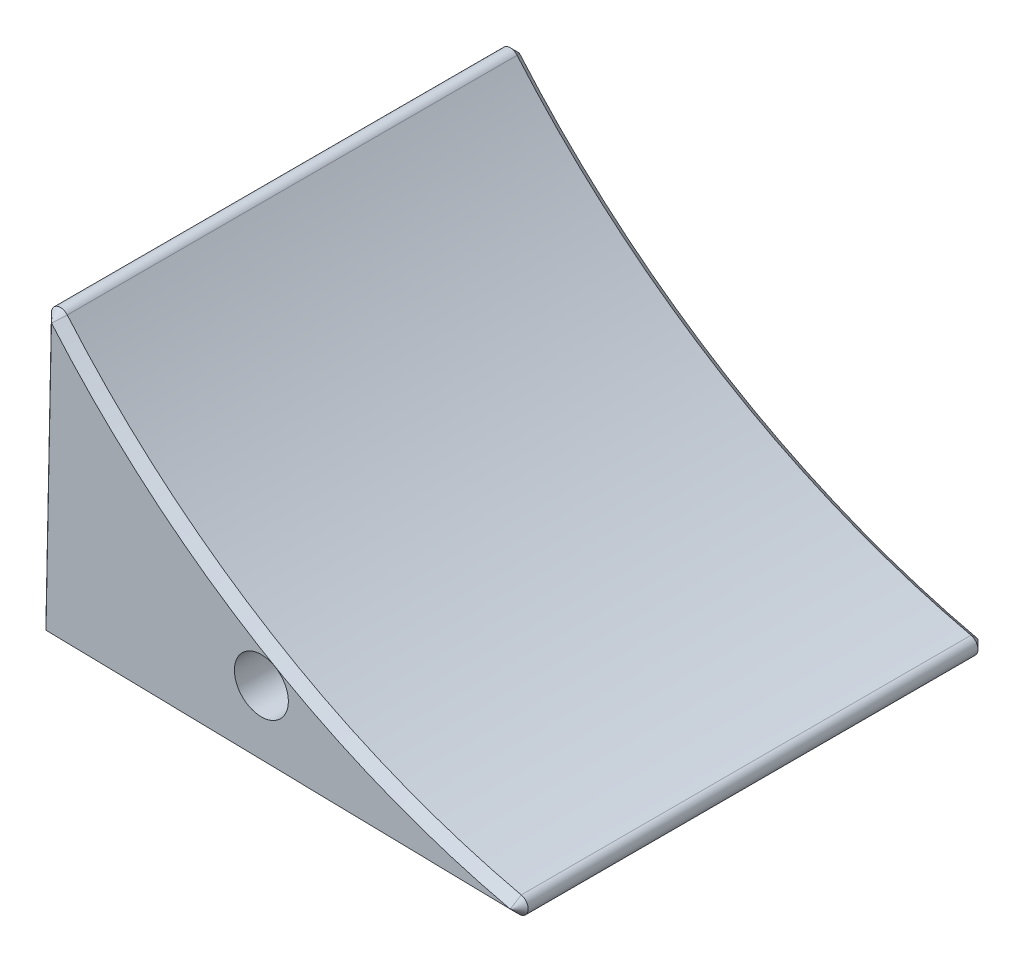
ISO-10303-21;
HEADER;
FILE_DESCRIPTION(('STEP AP214'),'2;1');
FILE_NAME('part.step','',(''),(''),'','','');
FILE_SCHEMA(('AUTOMOTIVE_DESIGN { 1 0 10303 214 1 1 1 1 }'));
ENDSEC;
DATA;
#1=APPLICATION_CONTEXT('core data for automotive mechanical design processes');
#2=APPLICATION_PROTOCOL_DEFINITION('international standard','automotive_design',2000,#1);
#3=PRODUCT_CONTEXT('',#1,'mechanical');
#4=PRODUCT('Part','Part','',(#3));
#5=PRODUCT_RELATED_PRODUCT_CATEGORY('part','',(#4));
#6=PRODUCT_DEFINITION_FORMATION('','',#4);
#7=PRODUCT_DEFINITION_CONTEXT('part definition',#1,'design');
#8=PRODUCT_DEFINITION('design','',#6,#7);
#9=PRODUCT_DEFINITION_SHAPE('','',#8);
#10=(LENGTH_UNIT() NAMED_UNIT(*) SI_UNIT(.MILLI.,.METRE.));
#11=(NAMED_UNIT(*) PLANE_ANGLE_UNIT() SI_UNIT($,.RADIAN.));
#12=(NAMED_UNIT(*) SI_UNIT($,.STERADIAN.) SOLID_ANGLE_UNIT());
#13=UNCERTAINTY_MEASURE_WITH_UNIT(LENGTH_MEASURE(1.E-05),#10,'distance_accuracy_value','');
#14=(GEOMETRIC_REPRESENTATION_CONTEXT(3) GLOBAL_UNCERTAINTY_ASSIGNED_CONTEXT((#13)) GLOBAL_UNIT_ASSIGNED_CONTEXT((#10,
#11,#12)) REPRESENTATION_CONTEXT('',''));
#15=CARTESIAN_POINT('',(0.,0.,0.));
#16=DIRECTION('',(0.,0.,1.));
#17=DIRECTION('',(1.,0.,0.));
#18=AXIS2_PLACEMENT_3D('',#15,#16,#17);
#19=CARTESIAN_POINT('',(-175.575532096117,156.509788423586,66.0260508410759));
#20=DIRECTION('',(0.,0.,-1.));
#21=DIRECTION('',(-1.,0.,0.));
#22=AXIS2_PLACEMENT_3D('',#19,#20,#21);
#23=CYLINDRICAL_SURFACE('',#22,47.);
#24=DIRECTION('',(0.,0.,-1.));
#25=VECTOR('',#24,1.);
#26=CARTESIAN_POINT('',(-211.327703681968,126.001064640119,66.0260508410759));
#27=LINE('',#26,#25);
#28=CARTESIAN_POINT('',(-211.327703681968,126.001064640119,0.5));
#29=VERTEX_POINT('',#28);
#30=CARTESIAN_POINT('',(-211.327703681968,126.001064640119,25.5));
#31=VERTEX_POINT('',#30);
#32=EDGE_CURVE('E115',#29,#31,#27,.F.);
#33=ORIENTED_EDGE('',*,*,#32,.T.);
#34=CARTESIAN_POINT('',(-175.575532096117,156.509788423586,25.5));
#35=DIRECTION('',(0.,0.,1.));
#36=DIRECTION('',(1.,0.,0.));
#37=AXIS2_PLACEMENT_3D('',#34,#35,#36);
#38=CIRCLE('',#37,47.);
#39=CARTESIAN_POINT('',(-186.099642102596,110.703204742073,25.5));
#40=VERTEX_POINT('',#39);
#41=EDGE_CURVE('E121',#31,#40,#38,.T.);
#42=ORIENTED_EDGE('',*,*,#41,.T.);
#43=DIRECTION('',(0.,0.,-1.));
#44=VECTOR('',#43,1.);
#45=CARTESIAN_POINT('',(-186.099642102596,110.703204742073,66.0260508410759));
#46=LINE('',#45,#44);
#47=CARTESIAN_POINT('',(-186.099642102596,110.703204742073,0.5));
#48=VERTEX_POINT('',#47);
#49=EDGE_CURVE('E117',#40,#48,#46,.T.);
#50=ORIENTED_EDGE('',*,*,#49,.T.);
#51=CARTESIAN_POINT('',(-175.575532096117,156.509788423586,0.5));
#52=DIRECTION('',(0.,0.,1.));
#53=DIRECTION('',(1.,0.,0.));
#54=AXIS2_PLACEMENT_3D('',#51,#52,#53);
#55=CIRCLE('',#54,47.);
#56=EDGE_CURVE('E113',#48,#29,#55,.F.);
#57=ORIENTED_EDGE('',*,*,#56,.T.);
#58=EDGE_LOOP('',(#33,#42,#50,#57));
#59=FACE_BOUND('',#58,.T.);
#60=ADVANCED_FACE('F37',(#59),#23,.F.);
#61=CARTESIAN_POINT('',(-212.180704616447,127.029942006808,66.0260508410759));
#62=DIRECTION('',(0.999794478558421,-0.0202731508181385,0.));
#63=DIRECTION('',(0.0202731508181385,0.999794478558421,0.));
#64=AXIS2_PLACEMENT_3D('',#61,#62,#63);
#65=PLANE('',#64);
#66=DIRECTION('',(0.,0.,-1.));
#67=VECTOR('',#66,1.);
#68=CARTESIAN_POINT('',(-212.510834837265,110.749178600073,66.0260508410759));
#69=LINE('',#68,#67);
#70=CARTESIAN_POINT('',(-212.510834837265,110.749178600073,0.5));
#71=VERTEX_POINT('',#70);
#72=CARTESIAN_POINT('',(-212.510834837265,110.749178600073,25.5));
#73=VERTEX_POINT('',#72);
#74=EDGE_CURVE('E201',#71,#73,#69,.F.);
#75=ORIENTED_EDGE('',*,*,#74,.T.);
#76=DIRECTION('',(0.0202731508181385,0.999794478558421,0.));
#77=VECTOR('',#76,1.);
#78=CARTESIAN_POINT('',(-212.20794317216,125.686640324215,25.5));
#79=LINE('',#78,#77);
#80=CARTESIAN_POINT('',(-212.20794317216,125.686640324215,25.5));
#81=VERTEX_POINT('',#80);
#82=EDGE_CURVE('E122',#73,#81,#79,.T.);
#83=ORIENTED_EDGE('',*,*,#82,.T.);
#84=DIRECTION('',(0.,0.,-1.));
#85=VECTOR('',#84,1.);
#86=CARTESIAN_POINT('',(-212.20794317216,125.686640324215,66.0260508410759));
#87=LINE('',#86,#85);
#88=CARTESIAN_POINT('',(-212.20794317216,125.686640324215,0.5));
#89=VERTEX_POINT('',#88);
#90=EDGE_CURVE('E138',#81,#89,#87,.T.);
#91=ORIENTED_EDGE('',*,*,#90,.T.);
#92=DIRECTION('',(-0.0202731508181385,-0.999794478558421,0.));
#93=VECTOR('',#92,1.);
#94=CARTESIAN_POINT('',(-212.180704616447,127.029942006808,0.5));
#95=LINE('',#94,#93);
#96=EDGE_CURVE('E213',#89,#71,#95,.T.);
#97=ORIENTED_EDGE('',*,*,#96,.T.);
#98=EDGE_LOOP('',(#75,#83,#91,#97));
#99=FACE_BOUND('',#98,.T.);
#100=ADVANCED_FACE('F239',(#99),#65,.F.);
#101=CARTESIAN_POINT('',(-212.520971412675,110.249281360793,66.0260508410759));
#102=DIRECTION('',(0.0202731508181363,0.999794478558421,0.));
#103=DIRECTION('',(-0.999794478558421,0.0202731508181363,0.));
#104=AXIS2_PLACEMENT_3D('',#101,#102,#103);
#105=PLANE('',#104);
#106=DIRECTION('',(0.,0.,-1.));
#107=VECTOR('',#106,1.);
#108=CARTESIAN_POINT('',(-186.221737295096,109.716003421075,66.0260508410759));
#109=LINE('',#108,#107);
#110=CARTESIAN_POINT('',(-186.221737295096,109.716003421075,0.5));
#111=VERTEX_POINT('',#110);
#112=CARTESIAN_POINT('',(-186.221737295096,109.716003421075,25.5));
#113=VERTEX_POINT('',#112);
#114=EDGE_CURVE('E198',#111,#113,#109,.F.);
#115=ORIENTED_EDGE('',*,*,#114,.T.);
#116=DIRECTION('',(-0.999794478558421,0.0202731508181363,0.));
#117=VECTOR('',#116,1.);
#118=CARTESIAN_POINT('',(-212.021074173395,110.239144785384,25.5));
#119=LINE('',#118,#117);
#120=CARTESIAN_POINT('',(-212.021074173395,110.239144785384,25.5));
#121=VERTEX_POINT('',#120);
#122=EDGE_CURVE('E227',#113,#121,#119,.T.);
#123=ORIENTED_EDGE('',*,*,#122,.T.);
#124=DIRECTION('',(0.,0.,-1.));
#125=VECTOR('',#124,1.);
#126=CARTESIAN_POINT('',(-212.021074173395,110.239144785384,66.0260508410759));
#127=LINE('',#126,#125);
#128=CARTESIAN_POINT('',(-212.021074173395,110.239144785384,0.5));
#129=VERTEX_POINT('',#128);
#130=EDGE_CURVE('E195',#121,#129,#127,.T.);
#131=ORIENTED_EDGE('',*,*,#130,.T.);
#132=DIRECTION('',(0.999794478558421,-0.0202731508181363,0.));
#133=VECTOR('',#132,1.);
#134=CARTESIAN_POINT('',(-212.520971412675,110.249281360793,0.5));
#135=LINE('',#134,#133);
#136=EDGE_CURVE('E225',#129,#111,#135,.T.);
#137=ORIENTED_EDGE('',*,*,#136,.T.);
#138=EDGE_LOOP('',(#115,#123,#131,#137));
#139=FACE_BOUND('',#138,.T.);
#140=ADVANCED_FACE('F264',(#139),#105,.F.);
#141=CARTESIAN_POINT('',(-175.575532096117,156.509788423586,0.));
#142=DIRECTION('',(0.,0.,1.));
#143=DIRECTION('',(1.,0.,0.));
#144=AXIS2_PLACEMENT_3D('',#141,#142,#143);
#145=PLANE('',#144);
#146=DIRECTION('',(-0.999794478558421,0.0202731508181363,0.));
#147=VECTOR('',#146,1.);
#148=CARTESIAN_POINT('',(-176.51823360916,110.01934517062,0.));
#149=LINE('',#148,#147);
#150=CARTESIAN_POINT('',(-186.211600719686,110.215900660355,0.));
#151=VERTEX_POINT('',#150);
#152=CARTESIAN_POINT('',(-212.010937597986,110.739042024664,0.));
#153=VERTEX_POINT('',#152);
#154=EDGE_CURVE('E62',#151,#153,#149,.T.);
#155=ORIENTED_EDGE('',*,*,#154,.T.);
#156=DIRECTION('',(0.0202731508181385,0.999794478558421,0.));
#157=VECTOR('',#156,1.);
#158=CARTESIAN_POINT('',(-211.068236084943,157.22948527763,0.));
#159=LINE('',#158,#157);
#160=CARTESIAN_POINT('',(-211.708045932881,125.676503748806,0.));
#161=VERTEX_POINT('',#160);
#162=EDGE_CURVE('E11',#153,#161,#159,.T.);
#163=ORIENTED_EDGE('',*,*,#162,.T.);
#164=CARTESIAN_POINT('',(-175.575532096117,156.509788423586,0.));
#165=DIRECTION('',(0.,0.,1.));
#166=DIRECTION('',(1.,0.,0.));
#167=AXIS2_PLACEMENT_3D('',#164,#165,#166);
#168=CIRCLE('',#167,47.5);
#169=EDGE_CURVE('E47',#161,#151,#168,.T.);
#170=ORIENTED_EDGE('',*,*,#169,.T.);
#171=EDGE_LOOP('',(#155,#163,#170));
#172=FACE_BOUND('',#171,.T.);
#173=CARTESIAN_POINT('',(-200.041202678783,114.052661860479,0.));
#174=DIRECTION('',(0.,0.,1.));
#175=DIRECTION('',(1.,0.,0.));
#176=AXIS2_PLACEMENT_3D('',#173,#174,#175);
#177=CIRCLE('',#176,1.49999999999857);
#178=CARTESIAN_POINT('',(-198.541202678784,114.052661860479,0.));
#179=VERTEX_POINT('',#178);
#180=EDGE_CURVE('E133',#179,#179,#177,.T.);
#181=ORIENTED_EDGE('',*,*,#180,.T.);
#182=EDGE_LOOP('',(#181));
#183=FACE_BOUND('',#182,.T.);
#184=ADVANCED_FACE('F229',(#172,#183),#145,.F.);
#185=CARTESIAN_POINT('',(-175.575532096131,156.509788423579,26.));
#186=DIRECTION('',(0.,0.,1.));
#187=DIRECTION('',(-0.721296738001005,-0.692626173162053,0.));
#188=AXIS2_PLACEMENT_3D('',#185,#186,#187);
#189=PLANE('',#188);
#190=CARTESIAN_POINT('',(-175.575532096117,156.509788423586,26.));
#191=DIRECTION('',(0.,0.,1.));
#192=DIRECTION('',(1.,0.,0.));
#193=AXIS2_PLACEMENT_3D('',#190,#191,#192);
#194=CIRCLE('',#193,47.5);
#195=CARTESIAN_POINT('',(-186.211600719686,110.215900660355,26.));
#196=VERTEX_POINT('',#195);
#197=CARTESIAN_POINT('',(-211.708045932881,125.676503748806,26.));
#198=VERTEX_POINT('',#197);
#199=EDGE_CURVE('E208',#196,#198,#194,.F.);
#200=ORIENTED_EDGE('',*,*,#199,.T.);
#201=DIRECTION('',(-0.0202731508181385,-0.999794478558421,0.));
#202=VECTOR('',#201,1.);
#203=CARTESIAN_POINT('',(-212.010937597986,110.739042024664,26.0000000000001));
#204=LINE('',#203,#202);
#205=CARTESIAN_POINT('',(-212.010937597986,110.739042024664,26.0000000000001));
#206=VERTEX_POINT('',#205);
#207=EDGE_CURVE('E210',#198,#206,#204,.T.);
#208=ORIENTED_EDGE('',*,*,#207,.T.);
#209=DIRECTION('',(0.999794478558421,-0.0202731508181363,0.));
#210=VECTOR('',#209,1.);
#211=CARTESIAN_POINT('',(-186.211600719687,110.215900660355,26.));
#212=LINE('',#211,#210);
#213=EDGE_CURVE('E206',#206,#196,#212,.T.);
#214=ORIENTED_EDGE('',*,*,#213,.T.);
#215=EDGE_LOOP('',(#200,#208,#214));
#216=FACE_BOUND('',#215,.T.);
#217=CARTESIAN_POINT('',(-200.041202678783,114.052661860479,26.0000000000001));
#218=DIRECTION('',(0.,0.,-1.));
#219=DIRECTION('',(-1.,0.,0.));
#220=AXIS2_PLACEMENT_3D('',#217,#218,#219);
#221=CIRCLE('',#220,1.49999999999857);
#222=CARTESIAN_POINT('',(-201.541202678782,114.052661860479,26.0000000000001));
#223=VERTEX_POINT('',#222);
#224=EDGE_CURVE('E182',#223,#223,#221,.T.);
#225=ORIENTED_EDGE('',*,*,#224,.T.);
#226=EDGE_LOOP('',(#225));
#227=FACE_BOUND('',#226,.T.);
#228=ADVANCED_FACE('F259',(#216,#227),#189,.T.);
#229=CARTESIAN_POINT('',(-200.041202678783,114.052661860479,26.0000000000001));
#230=DIRECTION('',(0.,0.,-1.));
#231=DIRECTION('',(-1.,0.,0.));
#232=AXIS2_PLACEMENT_3D('',#229,#230,#231);
#233=CYLINDRICAL_SURFACE('',#232,1.49999999999857);
#234=ORIENTED_EDGE('',*,*,#224,.F.);
#235=EDGE_LOOP('',(#234));
#236=FACE_BOUND('',#235,.T.);
#237=ORIENTED_EDGE('',*,*,#180,.F.);
#238=EDGE_LOOP('',(#237));
#239=FACE_BOUND('',#238,.T.);
#240=ADVANCED_FACE('F280',(#236,#239),#233,.F.);
#241=CARTESIAN_POINT('',(-186.211600719686,110.215900660354,66.0260508410759));
#242=DIRECTION('',(0.,0.,-1.));
#243=DIRECTION('',(-1.,0.,0.));
#244=AXIS2_PLACEMENT_3D('',#241,#242,#243);
#245=CYLINDRICAL_SURFACE('',#244,0.5);
#246=ORIENTED_EDGE('',*,*,#49,.F.);
#247=CARTESIAN_POINT('',(-186.211600719686,110.215900660354,25.5));
#248=DIRECTION('',(0.,0.,1.));
#249=DIRECTION('',(1.,0.,0.));
#250=AXIS2_PLACEMENT_3D('',#247,#248,#249);
#251=CIRCLE('',#250,0.5);
#252=EDGE_CURVE('E223',#40,#113,#251,.F.);
#253=ORIENTED_EDGE('',*,*,#252,.T.);
#254=ORIENTED_EDGE('',*,*,#114,.F.);
#255=CARTESIAN_POINT('',(-186.211600719686,110.215900660354,0.5));
#256=DIRECTION('',(0.,0.,1.));
#257=DIRECTION('',(1.,0.,0.));
#258=AXIS2_PLACEMENT_3D('',#255,#256,#257);
#259=CIRCLE('',#258,0.5);
#260=EDGE_CURVE('E221',#111,#48,#259,.T.);
#261=ORIENTED_EDGE('',*,*,#260,.T.);
#262=EDGE_LOOP('',(#246,#253,#254,#261));
#263=FACE_BOUND('',#262,.T.);
#264=ADVANCED_FACE('F255',(#263),#245,.T.);
#265=CARTESIAN_POINT('',(-211.708045932881,125.676503748806,66.0260508410759));
#266=DIRECTION('',(0.,0.,-1.));
#267=DIRECTION('',(-1.,0.,0.));
#268=AXIS2_PLACEMENT_3D('',#265,#266,#267);
#269=CYLINDRICAL_SURFACE('',#268,0.5);
#270=ORIENTED_EDGE('',*,*,#90,.F.);
#271=CARTESIAN_POINT('',(-211.708045932881,125.676503748806,25.5));
#272=DIRECTION('',(0.,0.,1.));
#273=DIRECTION('',(1.,0.,0.));
#274=AXIS2_PLACEMENT_3D('',#271,#272,#273);
#275=CIRCLE('',#274,0.5);
#276=EDGE_CURVE('E132',#81,#31,#275,.F.);
#277=ORIENTED_EDGE('',*,*,#276,.T.);
#278=ORIENTED_EDGE('',*,*,#32,.F.);
#279=CARTESIAN_POINT('',(-211.708045932881,125.676503748806,0.5));
#280=DIRECTION('',(0.,0.,1.));
#281=DIRECTION('',(1.,0.,0.));
#282=AXIS2_PLACEMENT_3D('',#279,#280,#281);
#283=CIRCLE('',#282,0.5);
#284=EDGE_CURVE('E129',#29,#89,#283,.T.);
#285=ORIENTED_EDGE('',*,*,#284,.T.);
#286=EDGE_LOOP('',(#270,#277,#278,#285));
#287=FACE_BOUND('',#286,.T.);
#288=ADVANCED_FACE('F128',(#287),#269,.T.);
#289=CARTESIAN_POINT('',(-212.010937597986,110.739042024664,66.0260508410759));
#290=DIRECTION('',(0.,0.,-1.));
#291=DIRECTION('',(-1.,0.,0.));
#292=AXIS2_PLACEMENT_3D('',#289,#290,#291);
#293=CYLINDRICAL_SURFACE('',#292,0.5);
#294=ORIENTED_EDGE('',*,*,#130,.F.);
#295=CARTESIAN_POINT('',(-212.010937597986,110.739042024664,25.5));
#296=DIRECTION('',(0.,0.,1.));
#297=DIRECTION('',(1.,0.,0.));
#298=AXIS2_PLACEMENT_3D('',#295,#296,#297);
#299=CIRCLE('',#298,0.5);
#300=EDGE_CURVE('E219',#121,#73,#299,.F.);
#301=ORIENTED_EDGE('',*,*,#300,.T.);
#302=ORIENTED_EDGE('',*,*,#74,.F.);
#303=CARTESIAN_POINT('',(-212.010937597986,110.739042024664,0.5));
#304=DIRECTION('',(0.,0.,1.));
#305=DIRECTION('',(1.,0.,0.));
#306=AXIS2_PLACEMENT_3D('',#303,#304,#305);
#307=CIRCLE('',#306,0.5);
#308=EDGE_CURVE('E217',#71,#129,#307,.T.);
#309=ORIENTED_EDGE('',*,*,#308,.T.);
#310=EDGE_LOOP('',(#294,#301,#302,#309));
#311=FACE_BOUND('',#310,.T.);
#312=ADVANCED_FACE('F242',(#311),#293,.T.);
#313=CARTESIAN_POINT('',(-176.518233609174,110.01934517062,26.));
#314=DIRECTION('',(-0.0143352824195215,-0.706961455581529,0.707106781186546));
#315=DIRECTION('',(-0.999794478558421,0.0202731508181363,0.));
#316=AXIS2_PLACEMENT_3D('',#313,#314,#315);
#317=PLANE('',#316);
#318=DIRECTION('',(0.0143352824195321,0.706961455581522,0.707106781186553));
#319=VECTOR('',#318,1.);
#320=CARTESIAN_POINT('',(-212.021074173395,110.239144785384,25.5));
#321=LINE('',#320,#319);
#322=EDGE_CURVE('E174',#121,#206,#321,.T.);
#323=ORIENTED_EDGE('',*,*,#322,.F.);
#324=ORIENTED_EDGE('',*,*,#122,.F.);
#325=DIRECTION('',(-0.0143352824195319,-0.706961455581532,-0.707106781186543));
#326=VECTOR('',#325,1.);
#327=CARTESIAN_POINT('',(-186.211600719686,110.215900660355,26.));
#328=LINE('',#327,#326);
#329=EDGE_CURVE('E146',#196,#113,#328,.T.);
#330=ORIENTED_EDGE('',*,*,#329,.F.);
#331=ORIENTED_EDGE('',*,*,#213,.F.);
#332=EDGE_LOOP('',(#323,#324,#330,#331));
#333=FACE_BOUND('',#332,.T.);
#334=ADVANCED_FACE('F262',(#333),#317,.T.);
#335=CARTESIAN_POINT('',(-186.211600719686,110.215900660354,25.5));
#336=DIRECTION('',(0.,0.,-1.));
#337=DIRECTION('',(-1.,0.,0.));
#338=AXIS2_PLACEMENT_3D('',#335,#336,#337);
#339=CONICAL_SURFACE('',#338,0.50000000000001,0.785398163397452);
#340=ORIENTED_EDGE('',*,*,#329,.T.);
#341=ORIENTED_EDGE('',*,*,#252,.F.);
#342=DIRECTION('',(0.158333394713501,0.689152041365709,-0.707106781186529));
#343=VECTOR('',#342,1.);
#344=CARTESIAN_POINT('',(-186.211600719686,110.215900660354,26.));
#345=LINE('',#344,#343);
#346=EDGE_CURVE('E172',#196,#40,#345,.T.);
#347=ORIENTED_EDGE('',*,*,#346,.F.);
#348=EDGE_LOOP('',(#340,#341,#347));
#349=FACE_BOUND('',#348,.T.);
#350=ADVANCED_FACE('F257',(#349),#339,.T.);
#351=CARTESIAN_POINT('',(-212.010937597986,110.739042024664,25.5));
#352=DIRECTION('',(0.,0.,-1.));
#353=DIRECTION('',(-1.,0.,0.));
#354=AXIS2_PLACEMENT_3D('',#351,#352,#353);
#355=CONICAL_SURFACE('',#354,0.50000000000001,0.785398163397455);
#356=ORIENTED_EDGE('',*,*,#300,.F.);
#357=ORIENTED_EDGE('',*,*,#322,.T.);
#358=DIRECTION('',(0.706961455581542,-0.0143352824195317,0.707106781186533));
#359=VECTOR('',#358,1.);
#360=CARTESIAN_POINT('',(-212.510834837265,110.749178600073,25.5));
#361=LINE('',#360,#359);
#362=EDGE_CURVE('E167',#73,#206,#361,.T.);
#363=ORIENTED_EDGE('',*,*,#362,.F.);
#364=EDGE_LOOP('',(#356,#357,#363));
#365=FACE_BOUND('',#364,.T.);
#366=ADVANCED_FACE('F243',(#365),#355,.T.);
#367=CARTESIAN_POINT('',(-175.575532096117,156.509788423586,26.));
#368=DIRECTION('',(0.,0.,1.));
#369=DIRECTION('',(1.,0.,0.));
#370=AXIS2_PLACEMENT_3D('',#367,#368,#369);
#371=CONICAL_SURFACE('',#370,47.5,0.785398163397441);
#372=ORIENTED_EDGE('',*,*,#346,.T.);
#373=ORIENTED_EDGE('',*,*,#41,.F.);
#374=DIRECTION('',(0.537885169585104,0.458998414311423,-0.70710678118655));
#375=VECTOR('',#374,1.);
#376=CARTESIAN_POINT('',(-211.708045932881,125.676503748806,26.));
#377=LINE('',#376,#375);
#378=EDGE_CURVE('E163',#198,#31,#377,.T.);
#379=ORIENTED_EDGE('',*,*,#378,.F.);
#380=ORIENTED_EDGE('',*,*,#199,.F.);
#381=EDGE_LOOP('',(#372,#373,#379,#380));
#382=FACE_BOUND('',#381,.T.);
#383=ADVANCED_FACE('F253',(#382),#371,.F.);
#384=CARTESIAN_POINT('',(-211.068236084943,157.229485277622,26.));
#385=DIRECTION('',(-0.706961455581505,0.0143352824195231,0.707106781186571));
#386=DIRECTION('',(0.0202731508181385,0.999794478558421,0.));
#387=AXIS2_PLACEMENT_3D('',#384,#385,#386);
#388=PLANE('',#387);
#389=ORIENTED_EDGE('',*,*,#362,.T.);
#390=ORIENTED_EDGE('',*,*,#207,.F.);
#391=DIRECTION('',(0.706961455581539,-0.0143352824195316,0.707106781186536));
#392=VECTOR('',#391,1.);
#393=CARTESIAN_POINT('',(-212.20794317216,125.686640324215,25.5));
#394=LINE('',#393,#392);
#395=EDGE_CURVE('E158',#81,#198,#394,.T.);
#396=ORIENTED_EDGE('',*,*,#395,.F.);
#397=ORIENTED_EDGE('',*,*,#82,.F.);
#398=EDGE_LOOP('',(#389,#390,#396,#397));
#399=FACE_BOUND('',#398,.T.);
#400=ADVANCED_FACE('F247',(#399),#388,.T.);
#401=CARTESIAN_POINT('',(-211.708045932881,125.676503748806,25.5));
#402=DIRECTION('',(0.,0.,-1.));
#403=DIRECTION('',(-1.,0.,0.));
#404=AXIS2_PLACEMENT_3D('',#401,#402,#403);
#405=CONICAL_SURFACE('',#404,0.50000000000001,0.785398163397453);
#406=ORIENTED_EDGE('',*,*,#378,.T.);
#407=ORIENTED_EDGE('',*,*,#276,.F.);
#408=ORIENTED_EDGE('',*,*,#395,.T.);
#409=EDGE_LOOP('',(#406,#407,#408));
#410=FACE_BOUND('',#409,.T.);
#411=ADVANCED_FACE('F248',(#410),#405,.T.);
#412=CARTESIAN_POINT('',(-212.520971412675,110.249281360793,0.5));
#413=DIRECTION('',(0.0143352824195218,0.706961455581531,0.707106781186544));
#414=DIRECTION('',(0.999794478558421,-0.0202731508181363,0.));
#415=AXIS2_PLACEMENT_3D('',#412,#413,#414);
#416=PLANE('',#415);
#417=DIRECTION('',(0.0143352824195319,0.706961455581534,-0.707106781186541));
#418=VECTOR('',#417,1.);
#419=CARTESIAN_POINT('',(-186.221737295096,109.716003421075,0.5));
#420=LINE('',#419,#418);
#421=EDGE_CURVE('E152',#111,#151,#420,.T.);
#422=ORIENTED_EDGE('',*,*,#421,.F.);
#423=ORIENTED_EDGE('',*,*,#136,.F.);
#424=DIRECTION('',(-0.0143352824195321,-0.706961455581525,0.70710678118655));
#425=VECTOR('',#424,1.);
#426=CARTESIAN_POINT('',(-212.010937597986,110.739042024664,0.));
#427=LINE('',#426,#425);
#428=EDGE_CURVE('E42',#153,#129,#427,.T.);
#429=ORIENTED_EDGE('',*,*,#428,.F.);
#430=ORIENTED_EDGE('',*,*,#154,.F.);
#431=EDGE_LOOP('',(#422,#423,#429,#430));
#432=FACE_BOUND('',#431,.T.);
#433=ADVANCED_FACE('F40',(#432),#416,.F.);
#434=CARTESIAN_POINT('',(-212.010937597986,110.739042024664,0.5));
#435=DIRECTION('',(0.,0.,1.));
#436=DIRECTION('',(1.,0.,0.));
#437=AXIS2_PLACEMENT_3D('',#434,#435,#436);
#438=CONICAL_SURFACE('',#437,0.499999999999996,0.785398163397444);
#439=ORIENTED_EDGE('',*,*,#428,.T.);
#440=ORIENTED_EDGE('',*,*,#308,.F.);
#441=DIRECTION('',(-0.706961455581525,0.0143352824195321,0.70710678118655));
#442=VECTOR('',#441,1.);
#443=CARTESIAN_POINT('',(-212.010937597986,110.739042024664,0.));
#444=LINE('',#443,#442);
#445=EDGE_CURVE('E150',#153,#71,#444,.T.);
#446=ORIENTED_EDGE('',*,*,#445,.F.);
#447=EDGE_LOOP('',(#439,#440,#446));
#448=FACE_BOUND('',#447,.T.);
#449=ADVANCED_FACE('F234',(#448),#438,.T.);
#450=CARTESIAN_POINT('',(-186.211600719686,110.215900660354,0.5));
#451=DIRECTION('',(0.,0.,1.));
#452=DIRECTION('',(1.,0.,0.));
#453=AXIS2_PLACEMENT_3D('',#450,#451,#452);
#454=CONICAL_SURFACE('',#453,0.499999999999996,0.785398163397444);
#455=ORIENTED_EDGE('',*,*,#260,.F.);
#456=ORIENTED_EDGE('',*,*,#421,.T.);
#457=DIRECTION('',(-0.158333394713509,-0.689152041365683,-0.707106781186553));
#458=VECTOR('',#457,1.);
#459=CARTESIAN_POINT('',(-186.099642102596,110.703204742073,0.5));
#460=LINE('',#459,#458);
#461=EDGE_CURVE('E143',#48,#151,#460,.T.);
#462=ORIENTED_EDGE('',*,*,#461,.F.);
#463=EDGE_LOOP('',(#455,#456,#462));
#464=FACE_BOUND('',#463,.T.);
#465=ADVANCED_FACE('F333',(#464),#454,.T.);
#466=CARTESIAN_POINT('',(-212.180704616447,127.029942006808,0.5));
#467=DIRECTION('',(0.706961455581538,-0.0143352824195236,0.707106781186537));
#468=DIRECTION('',(-0.0202731508181385,-0.999794478558421,0.));
#469=AXIS2_PLACEMENT_3D('',#466,#467,#468);
#470=PLANE('',#469);
#471=ORIENTED_EDGE('',*,*,#445,.T.);
#472=ORIENTED_EDGE('',*,*,#96,.F.);
#473=DIRECTION('',(-0.706961455581525,0.0143352824195321,0.70710678118655));
#474=VECTOR('',#473,1.);
#475=CARTESIAN_POINT('',(-211.708045932881,125.676503748806,0.));
#476=LINE('',#475,#474);
#477=EDGE_CURVE('E136',#161,#89,#476,.T.);
#478=ORIENTED_EDGE('',*,*,#477,.F.);
#479=ORIENTED_EDGE('',*,*,#162,.F.);
#480=EDGE_LOOP('',(#471,#472,#478,#479));
#481=FACE_BOUND('',#480,.T.);
#482=ADVANCED_FACE('F236',(#481),#470,.F.);
#483=CARTESIAN_POINT('',(-175.575532096117,156.509788423586,0.5));
#484=DIRECTION('',(0.,0.,-1.));
#485=DIRECTION('',(-1.,0.,0.));
#486=AXIS2_PLACEMENT_3D('',#483,#484,#485);
#487=CONICAL_SURFACE('',#486,47.,0.785398163397441);
#488=ORIENTED_EDGE('',*,*,#461,.T.);
#489=ORIENTED_EDGE('',*,*,#169,.F.);
#490=DIRECTION('',(-0.537885169585101,-0.458998414311414,-0.707106781186558));
#491=VECTOR('',#490,1.);
#492=CARTESIAN_POINT('',(-211.327703681968,126.001064640119,0.5));
#493=LINE('',#492,#491);
#494=EDGE_CURVE('E55',#29,#161,#493,.T.);
#495=ORIENTED_EDGE('',*,*,#494,.F.);
#496=ORIENTED_EDGE('',*,*,#56,.F.);
#497=EDGE_LOOP('',(#488,#489,#495,#496));
#498=FACE_BOUND('',#497,.T.);
#499=ADVANCED_FACE('F141',(#498),#487,.F.);
#500=CARTESIAN_POINT('',(-211.708045932881,125.676503748806,0.5));
#501=DIRECTION('',(0.,0.,1.));
#502=DIRECTION('',(1.,0.,0.));
#503=AXIS2_PLACEMENT_3D('',#500,#501,#502);
#504=CONICAL_SURFACE('',#503,0.499999999999996,0.785398163397444);
#505=ORIENTED_EDGE('',*,*,#477,.T.);
#506=ORIENTED_EDGE('',*,*,#284,.F.);
#507=ORIENTED_EDGE('',*,*,#494,.T.);
#508=EDGE_LOOP('',(#505,#506,#507));
#509=FACE_BOUND('',#508,.T.);
#510=ADVANCED_FACE('F135',(#509),#504,.T.);
#511=CLOSED_SHELL('',(#60,#100,#140,#184,#228,#240,#264,#288,#312,#334,#350,#366,#383,#400,#411,
#433,#449,#465,#482,#499,#510));
#512=MANIFOLD_SOLID_BREP('B2',#511);
#513=ADVANCED_BREP_SHAPE_REPRESENTATION('',(#18,#512),#14);
#514=SHAPE_DEFINITION_REPRESENTATION(#9,#513);
ENDSEC;
END-ISO-10303-21;
